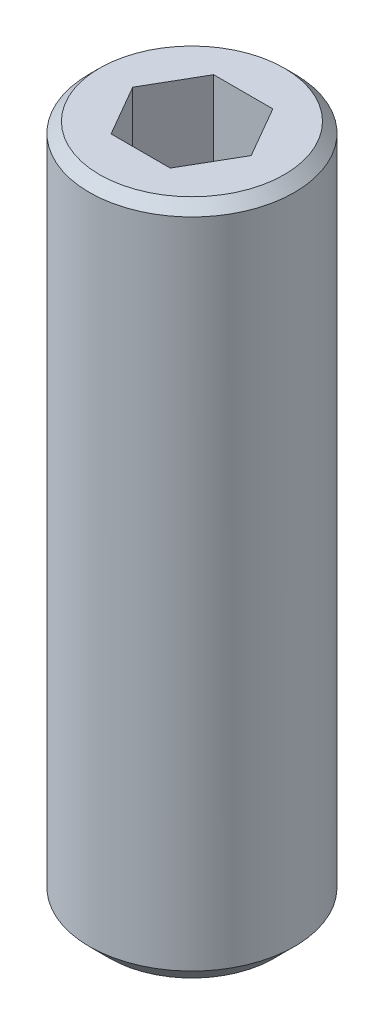
ISO-10303-21;
HEADER;
FILE_DESCRIPTION(('STEP AP214'),'2;1');
FILE_NAME('part.step','',(''),(''),'','','');
FILE_SCHEMA(('AUTOMOTIVE_DESIGN { 1 0 10303 214 1 1 1 1 }'));
ENDSEC;
DATA;
#1=APPLICATION_CONTEXT('core data for automotive mechanical design processes');
#2=APPLICATION_PROTOCOL_DEFINITION('international standard','automotive_design',2000,#1);
#3=PRODUCT_CONTEXT('',#1,'mechanical');
#4=PRODUCT('Part','Part','',(#3));
#5=PRODUCT_RELATED_PRODUCT_CATEGORY('part','',(#4));
#6=PRODUCT_DEFINITION_FORMATION('','',#4);
#7=PRODUCT_DEFINITION_CONTEXT('part definition',#1,'design');
#8=PRODUCT_DEFINITION('design','',#6,#7);
#9=PRODUCT_DEFINITION_SHAPE('','',#8);
#10=(LENGTH_UNIT() NAMED_UNIT(*) SI_UNIT(.MILLI.,.METRE.));
#11=(NAMED_UNIT(*) PLANE_ANGLE_UNIT() SI_UNIT($,.RADIAN.));
#12=(NAMED_UNIT(*) SI_UNIT($,.STERADIAN.) SOLID_ANGLE_UNIT());
#13=UNCERTAINTY_MEASURE_WITH_UNIT(LENGTH_MEASURE(1.E-05),#10,'distance_accuracy_value','');
#14=(GEOMETRIC_REPRESENTATION_CONTEXT(3) GLOBAL_UNCERTAINTY_ASSIGNED_CONTEXT((#13)) GLOBAL_UNIT_ASSIGNED_CONTEXT((#10,
#11,#12)) REPRESENTATION_CONTEXT('',''));
#15=CARTESIAN_POINT('',(0.,0.,0.));
#16=DIRECTION('',(0.,0.,1.));
#17=DIRECTION('',(1.,0.,0.));
#18=AXIS2_PLACEMENT_3D('',#15,#16,#17);
#19=CARTESIAN_POINT('',(0.,0.,0.));
#20=DIRECTION('',(0.,-1.,0.));
#21=DIRECTION('',(0.,0.,-1.));
#22=AXIS2_PLACEMENT_3D('',#19,#20,#21);
#23=PLANE('',#22);
#24=CARTESIAN_POINT('',(0.,0.,0.));
#25=DIRECTION('',(0.,-1.,0.));
#26=DIRECTION('',(0.,0.,-1.));
#27=AXIS2_PLACEMENT_3D('',#24,#25,#26);
#28=CIRCLE('',#27,1.35);
#29=CARTESIAN_POINT('',(0.,0.,-1.35));
#30=VERTEX_POINT('',#29);
#31=EDGE_CURVE('E42',#30,#30,#28,.F.);
#32=ORIENTED_EDGE('',*,*,#31,.T.);
#33=EDGE_LOOP('',(#32));
#34=FACE_BOUND('',#33,.T.);
#35=DIRECTION('',(-0.5,0.,0.866025403784439));
#36=VECTOR('',#35,1.);
#37=CARTESIAN_POINT('',(-0.43301270189222,0.,-0.75));
#38=LINE('',#37,#36);
#39=CARTESIAN_POINT('',(-0.43301270189222,0.,-0.75));
#40=VERTEX_POINT('',#39);
#41=CARTESIAN_POINT('',(-0.866025403784439,0.,0.));
#42=VERTEX_POINT('',#41);
#43=EDGE_CURVE('E123',#40,#42,#38,.T.);
#44=ORIENTED_EDGE('',*,*,#43,.F.);
#45=DIRECTION('',(-1.,0.,0.));
#46=VECTOR('',#45,1.);
#47=CARTESIAN_POINT('',(0.43301270189222,0.,-0.75));
#48=LINE('',#47,#46);
#49=CARTESIAN_POINT('',(0.43301270189222,0.,-0.75));
#50=VERTEX_POINT('',#49);
#51=EDGE_CURVE('E49',#50,#40,#48,.T.);
#52=ORIENTED_EDGE('',*,*,#51,.F.);
#53=DIRECTION('',(-0.5,0.,-0.866025403784439));
#54=VECTOR('',#53,1.);
#55=CARTESIAN_POINT('',(0.866025403784439,0.,0.));
#56=LINE('',#55,#54);
#57=CARTESIAN_POINT('',(0.866025403784439,0.,0.));
#58=VERTEX_POINT('',#57);
#59=EDGE_CURVE('E132',#58,#50,#56,.T.);
#60=ORIENTED_EDGE('',*,*,#59,.F.);
#61=DIRECTION('',(0.5,0.,-0.866025403784439));
#62=VECTOR('',#61,1.);
#63=CARTESIAN_POINT('',(0.43301270189222,0.,0.75));
#64=LINE('',#63,#62);
#65=CARTESIAN_POINT('',(0.43301270189222,0.,0.75));
#66=VERTEX_POINT('',#65);
#67=EDGE_CURVE('E130',#66,#58,#64,.T.);
#68=ORIENTED_EDGE('',*,*,#67,.F.);
#69=DIRECTION('',(1.,0.,0.));
#70=VECTOR('',#69,1.);
#71=CARTESIAN_POINT('',(-0.433012701892219,0.,0.750000000000001));
#72=LINE('',#71,#70);
#73=CARTESIAN_POINT('',(-0.433012701892219,0.,0.750000000000001));
#74=VERTEX_POINT('',#73);
#75=EDGE_CURVE('E97',#74,#66,#72,.T.);
#76=ORIENTED_EDGE('',*,*,#75,.F.);
#77=DIRECTION('',(0.5,0.,0.866025403784438));
#78=VECTOR('',#77,1.);
#79=CARTESIAN_POINT('',(-0.866025403784439,0.,0.));
#80=LINE('',#79,#78);
#81=EDGE_CURVE('E126',#42,#74,#80,.T.);
#82=ORIENTED_EDGE('',*,*,#81,.F.);
#83=EDGE_LOOP('',(#44,#52,#60,#68,#76,#82));
#84=FACE_BOUND('',#83,.T.);
#85=ADVANCED_FACE('F34',(#34,#84),#23,.F.);
#86=CARTESIAN_POINT('',(0.,0.,0.));
#87=DIRECTION('',(0.,1.,0.));
#88=DIRECTION('',(0.,0.,1.));
#89=AXIS2_PLACEMENT_3D('',#86,#87,#88);
#90=CYLINDRICAL_SURFACE('',#89,1.5);
#91=CARTESIAN_POINT('',(0.,-0.15,0.));
#92=DIRECTION('',(0.,-1.,0.));
#93=DIRECTION('',(0.,0.,-1.));
#94=AXIS2_PLACEMENT_3D('',#91,#92,#93);
#95=CIRCLE('',#94,1.5);
#96=CARTESIAN_POINT('',(0.,-0.15,-1.5));
#97=VERTEX_POINT('',#96);
#98=EDGE_CURVE('E11',#97,#97,#95,.T.);
#99=ORIENTED_EDGE('',*,*,#98,.T.);
#100=EDGE_LOOP('',(#99));
#101=FACE_BOUND('',#100,.T.);
#102=CARTESIAN_POINT('',(0.,-9.7,0.));
#103=DIRECTION('',(0.,1.,0.));
#104=DIRECTION('',(0.,0.,1.));
#105=AXIS2_PLACEMENT_3D('',#102,#103,#104);
#106=CIRCLE('',#105,1.5);
#107=CARTESIAN_POINT('',(0.,-9.7,1.5));
#108=VERTEX_POINT('',#107);
#109=EDGE_CURVE('E136',#108,#108,#106,.T.);
#110=ORIENTED_EDGE('',*,*,#109,.T.);
#111=EDGE_LOOP('',(#110));
#112=FACE_BOUND('',#111,.T.);
#113=ADVANCED_FACE('F160',(#101,#112),#90,.T.);
#114=CARTESIAN_POINT('',(1.5,-10.,0.));
#115=DIRECTION('',(0.,1.,0.));
#116=DIRECTION('',(0.,0.,1.));
#117=AXIS2_PLACEMENT_3D('',#114,#115,#116);
#118=PLANE('',#117);
#119=CARTESIAN_POINT('',(0.,-10.,0.));
#120=DIRECTION('',(0.,1.,0.));
#121=DIRECTION('',(0.,0.,1.));
#122=AXIS2_PLACEMENT_3D('',#119,#120,#121);
#123=CIRCLE('',#122,1.2);
#124=CARTESIAN_POINT('',(0.,-10.,1.2));
#125=VERTEX_POINT('',#124);
#126=EDGE_CURVE('E144',#125,#125,#123,.F.);
#127=ORIENTED_EDGE('',*,*,#126,.T.);
#128=EDGE_LOOP('',(#127));
#129=FACE_BOUND('',#128,.T.);
#130=ADVANCED_FACE('F165',(#129),#118,.F.);
#131=CARTESIAN_POINT('',(0.43301270189222,-1.5,-0.75));
#132=DIRECTION('',(0.,0.,-1.));
#133=DIRECTION('',(-1.,0.,0.));
#134=AXIS2_PLACEMENT_3D('',#131,#132,#133);
#135=PLANE('',#134);
#136=ORIENTED_EDGE('',*,*,#51,.T.);
#137=DIRECTION('',(0.,1.,0.));
#138=VECTOR('',#137,1.);
#139=CARTESIAN_POINT('',(-0.43301270189222,-1.5,-0.75));
#140=LINE('',#139,#138);
#141=CARTESIAN_POINT('',(-0.43301270189222,-1.5,-0.75));
#142=VERTEX_POINT('',#141);
#143=EDGE_CURVE('E79',#142,#40,#140,.T.);
#144=ORIENTED_EDGE('',*,*,#143,.F.);
#145=DIRECTION('',(-1.,0.,0.));
#146=VECTOR('',#145,1.);
#147=CARTESIAN_POINT('',(0.43301270189222,-1.5,-0.75));
#148=LINE('',#147,#146);
#149=CARTESIAN_POINT('',(0.43301270189222,-1.5,-0.75));
#150=VERTEX_POINT('',#149);
#151=EDGE_CURVE('E134',#150,#142,#148,.T.);
#152=ORIENTED_EDGE('',*,*,#151,.F.);
#153=DIRECTION('',(0.,1.,0.));
#154=VECTOR('',#153,1.);
#155=CARTESIAN_POINT('',(0.43301270189222,-1.5,-0.75));
#156=LINE('',#155,#154);
#157=EDGE_CURVE('E57',#150,#50,#156,.T.);
#158=ORIENTED_EDGE('',*,*,#157,.T.);
#159=EDGE_LOOP('',(#136,#144,#152,#158));
#160=FACE_BOUND('',#159,.T.);
#161=ADVANCED_FACE('F171',(#160),#135,.F.);
#162=CARTESIAN_POINT('',(0.866025403784439,-1.5,0.));
#163=DIRECTION('',(0.866025403784439,0.,-0.5));
#164=DIRECTION('',(-0.5,0.,-0.866025403784439));
#165=AXIS2_PLACEMENT_3D('',#162,#163,#164);
#166=PLANE('',#165);
#167=ORIENTED_EDGE('',*,*,#59,.T.);
#168=ORIENTED_EDGE('',*,*,#157,.F.);
#169=DIRECTION('',(-0.5,0.,-0.866025403784439));
#170=VECTOR('',#169,1.);
#171=CARTESIAN_POINT('',(0.866025403784439,-1.5,0.));
#172=LINE('',#171,#170);
#173=CARTESIAN_POINT('',(0.866025403784439,-1.5,0.));
#174=VERTEX_POINT('',#173);
#175=EDGE_CURVE('E109',#174,#150,#172,.T.);
#176=ORIENTED_EDGE('',*,*,#175,.F.);
#177=DIRECTION('',(0.,1.,0.));
#178=VECTOR('',#177,1.);
#179=CARTESIAN_POINT('',(0.866025403784439,-1.5,0.));
#180=LINE('',#179,#178);
#181=EDGE_CURVE('E101',#174,#58,#180,.T.);
#182=ORIENTED_EDGE('',*,*,#181,.T.);
#183=EDGE_LOOP('',(#167,#168,#176,#182));
#184=FACE_BOUND('',#183,.T.);
#185=ADVANCED_FACE('F175',(#184),#166,.F.);
#186=CARTESIAN_POINT('',(0.43301270189222,-1.5,0.75));
#187=DIRECTION('',(0.866025403784439,0.,0.5));
#188=DIRECTION('',(0.5,0.,-0.866025403784439));
#189=AXIS2_PLACEMENT_3D('',#186,#187,#188);
#190=PLANE('',#189);
#191=ORIENTED_EDGE('',*,*,#67,.T.);
#192=ORIENTED_EDGE('',*,*,#181,.F.);
#193=DIRECTION('',(0.5,0.,-0.866025403784439));
#194=VECTOR('',#193,1.);
#195=CARTESIAN_POINT('',(0.43301270189222,-1.5,0.75));
#196=LINE('',#195,#194);
#197=CARTESIAN_POINT('',(0.43301270189222,-1.5,0.75));
#198=VERTEX_POINT('',#197);
#199=EDGE_CURVE('E105',#198,#174,#196,.T.);
#200=ORIENTED_EDGE('',*,*,#199,.F.);
#201=DIRECTION('',(0.,1.,0.));
#202=VECTOR('',#201,1.);
#203=CARTESIAN_POINT('',(0.43301270189222,-1.5,0.75));
#204=LINE('',#203,#202);
#205=EDGE_CURVE('E90',#198,#66,#204,.T.);
#206=ORIENTED_EDGE('',*,*,#205,.T.);
#207=EDGE_LOOP('',(#191,#192,#200,#206));
#208=FACE_BOUND('',#207,.T.);
#209=ADVANCED_FACE('F106',(#208),#190,.F.);
#210=CARTESIAN_POINT('',(-0.433012701892219,-1.5,0.750000000000001));
#211=DIRECTION('',(0.,0.,1.));
#212=DIRECTION('',(1.,0.,0.));
#213=AXIS2_PLACEMENT_3D('',#210,#211,#212);
#214=PLANE('',#213);
#215=ORIENTED_EDGE('',*,*,#75,.T.);
#216=ORIENTED_EDGE('',*,*,#205,.F.);
#217=DIRECTION('',(1.,0.,0.));
#218=VECTOR('',#217,1.);
#219=CARTESIAN_POINT('',(-0.433012701892219,-1.5,0.750000000000001));
#220=LINE('',#219,#218);
#221=CARTESIAN_POINT('',(-0.433012701892219,-1.5,0.750000000000001));
#222=VERTEX_POINT('',#221);
#223=EDGE_CURVE('E94',#222,#198,#220,.T.);
#224=ORIENTED_EDGE('',*,*,#223,.F.);
#225=DIRECTION('',(0.,1.,0.));
#226=VECTOR('',#225,1.);
#227=CARTESIAN_POINT('',(-0.433012701892219,-1.5,0.750000000000001));
#228=LINE('',#227,#226);
#229=EDGE_CURVE('E102',#222,#74,#228,.T.);
#230=ORIENTED_EDGE('',*,*,#229,.T.);
#231=EDGE_LOOP('',(#215,#216,#224,#230));
#232=FACE_BOUND('',#231,.T.);
#233=ADVANCED_FACE('F92',(#232),#214,.F.);
#234=CARTESIAN_POINT('',(-0.866025403784439,-1.5,0.));
#235=DIRECTION('',(-0.866025403784438,0.,0.5));
#236=DIRECTION('',(0.5,0.,0.866025403784438));
#237=AXIS2_PLACEMENT_3D('',#234,#235,#236);
#238=PLANE('',#237);
#239=ORIENTED_EDGE('',*,*,#81,.T.);
#240=ORIENTED_EDGE('',*,*,#229,.F.);
#241=DIRECTION('',(0.5,0.,0.866025403784438));
#242=VECTOR('',#241,1.);
#243=CARTESIAN_POINT('',(-0.866025403784439,-1.5,0.));
#244=LINE('',#243,#242);
#245=CARTESIAN_POINT('',(-0.866025403784439,-1.5,0.));
#246=VERTEX_POINT('',#245);
#247=EDGE_CURVE('E115',#246,#222,#244,.T.);
#248=ORIENTED_EDGE('',*,*,#247,.F.);
#249=DIRECTION('',(0.,1.,0.));
#250=VECTOR('',#249,1.);
#251=CARTESIAN_POINT('',(-0.866025403784439,-1.5,0.));
#252=LINE('',#251,#250);
#253=EDGE_CURVE('E139',#246,#42,#252,.T.);
#254=ORIENTED_EDGE('',*,*,#253,.T.);
#255=EDGE_LOOP('',(#239,#240,#248,#254));
#256=FACE_BOUND('',#255,.T.);
#257=ADVANCED_FACE('F179',(#256),#238,.F.);
#258=CARTESIAN_POINT('',(-0.43301270189222,-1.5,-0.75));
#259=DIRECTION('',(-0.866025403784439,0.,-0.5));
#260=DIRECTION('',(-0.5,0.,0.866025403784439));
#261=AXIS2_PLACEMENT_3D('',#258,#259,#260);
#262=PLANE('',#261);
#263=ORIENTED_EDGE('',*,*,#43,.T.);
#264=ORIENTED_EDGE('',*,*,#253,.F.);
#265=DIRECTION('',(-0.5,0.,0.866025403784439));
#266=VECTOR('',#265,1.);
#267=CARTESIAN_POINT('',(-0.43301270189222,-1.5,-0.75));
#268=LINE('',#267,#266);
#269=EDGE_CURVE('E117',#142,#246,#268,.T.);
#270=ORIENTED_EDGE('',*,*,#269,.F.);
#271=ORIENTED_EDGE('',*,*,#143,.T.);
#272=EDGE_LOOP('',(#263,#264,#270,#271));
#273=FACE_BOUND('',#272,.T.);
#274=ADVANCED_FACE('F176',(#273),#262,.F.);
#275=CARTESIAN_POINT('',(-0.43301270189222,-1.5,-0.75));
#276=DIRECTION('',(0.,1.,0.));
#277=DIRECTION('',(0.,0.,1.));
#278=AXIS2_PLACEMENT_3D('',#275,#276,#277);
#279=PLANE('',#278);
#280=ORIENTED_EDGE('',*,*,#151,.T.);
#281=ORIENTED_EDGE('',*,*,#269,.T.);
#282=ORIENTED_EDGE('',*,*,#247,.T.);
#283=ORIENTED_EDGE('',*,*,#223,.T.);
#284=ORIENTED_EDGE('',*,*,#199,.T.);
#285=ORIENTED_EDGE('',*,*,#175,.T.);
#286=EDGE_LOOP('',(#280,#281,#282,#283,#284,#285));
#287=FACE_BOUND('',#286,.T.);
#288=ADVANCED_FACE('F112',(#287),#279,.T.);
#289=CARTESIAN_POINT('',(0.,-9.7,0.));
#290=DIRECTION('',(0.,1.,0.));
#291=DIRECTION('',(0.,0.,1.));
#292=AXIS2_PLACEMENT_3D('',#289,#290,#291);
#293=CONICAL_SURFACE('',#292,1.5,0.78539816339745);
#294=ORIENTED_EDGE('',*,*,#126,.F.);
#295=EDGE_LOOP('',(#294));
#296=FACE_BOUND('',#295,.T.);
#297=ORIENTED_EDGE('',*,*,#109,.F.);
#298=EDGE_LOOP('',(#297));
#299=FACE_BOUND('',#298,.T.);
#300=ADVANCED_FACE('F152',(#296,#299),#293,.T.);
#301=CARTESIAN_POINT('',(0.,0.,0.));
#302=DIRECTION('',(0.,-1.,0.));
#303=DIRECTION('',(0.,0.,-1.));
#304=AXIS2_PLACEMENT_3D('',#301,#302,#303);
#305=CONICAL_SURFACE('',#304,1.35,0.785398163397449);
#306=ORIENTED_EDGE('',*,*,#98,.F.);
#307=EDGE_LOOP('',(#306));
#308=FACE_BOUND('',#307,.T.);
#309=ORIENTED_EDGE('',*,*,#31,.F.);
#310=EDGE_LOOP('',(#309));
#311=FACE_BOUND('',#310,.T.);
#312=ADVANCED_FACE('F36',(#308,#311),#305,.T.);
#313=CLOSED_SHELL('',(#85,#113,#130,#161,#185,#209,#233,#257,#274,#288,#300,#312));
#314=MANIFOLD_SOLID_BREP('B2',#313);
#315=ADVANCED_BREP_SHAPE_REPRESENTATION('',(#18,#314),#14);
#316=SHAPE_DEFINITION_REPRESENTATION(#9,#315);
ENDSEC;
END-ISO-10303-21;
